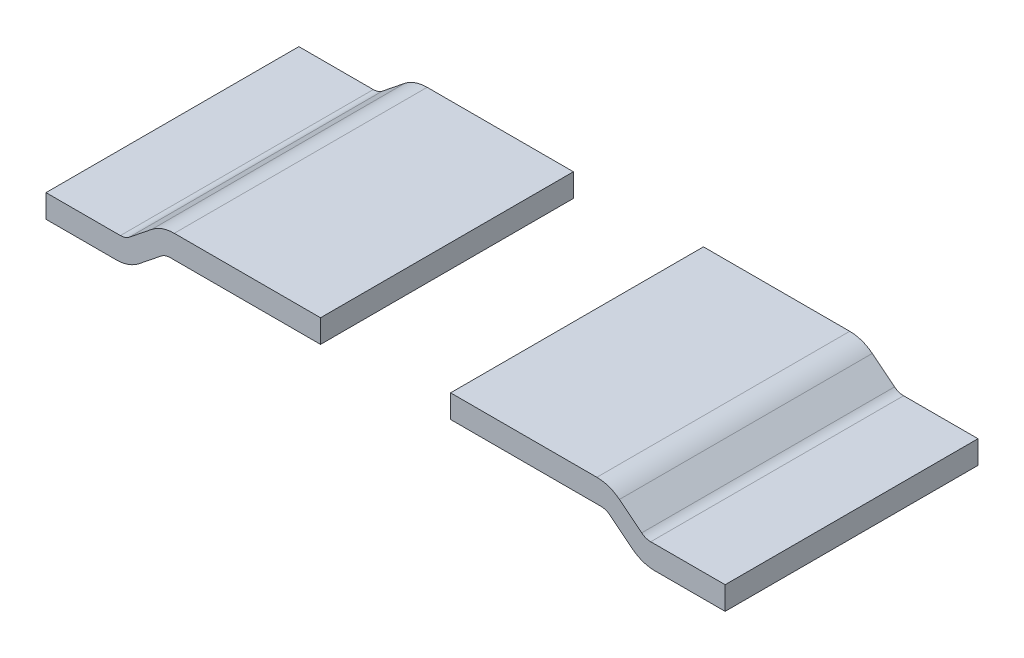
ISO-10303-21;
HEADER;
FILE_DESCRIPTION(('STEP AP214'),'2;1');
FILE_NAME('part.step','',(''),(''),'','','');
FILE_SCHEMA(('AUTOMOTIVE_DESIGN { 1 0 10303 214 1 1 1 1 }'));
ENDSEC;
DATA;
#1=APPLICATION_CONTEXT('core data for automotive mechanical design processes');
#2=APPLICATION_PROTOCOL_DEFINITION('international standard','automotive_design',2000,#1);
#3=PRODUCT_CONTEXT('',#1,'mechanical');
#4=PRODUCT('Part','Part','',(#3));
#5=PRODUCT_RELATED_PRODUCT_CATEGORY('part','',(#4));
#6=PRODUCT_DEFINITION_FORMATION('','',#4);
#7=PRODUCT_DEFINITION_CONTEXT('part definition',#1,'design');
#8=PRODUCT_DEFINITION('design','',#6,#7);
#9=PRODUCT_DEFINITION_SHAPE('','',#8);
#10=(LENGTH_UNIT() NAMED_UNIT(*) SI_UNIT(.MILLI.,.METRE.));
#11=(NAMED_UNIT(*) PLANE_ANGLE_UNIT() SI_UNIT($,.RADIAN.));
#12=(NAMED_UNIT(*) SI_UNIT($,.STERADIAN.) SOLID_ANGLE_UNIT());
#13=UNCERTAINTY_MEASURE_WITH_UNIT(LENGTH_MEASURE(1.E-05),#10,'distance_accuracy_value','');
#14=(GEOMETRIC_REPRESENTATION_CONTEXT(3) GLOBAL_UNCERTAINTY_ASSIGNED_CONTEXT((#13)) GLOBAL_UNIT_ASSIGNED_CONTEXT((#10,
#11,#12)) REPRESENTATION_CONTEXT('',''));
#15=CARTESIAN_POINT('',(0.,0.,0.));
#16=DIRECTION('',(0.,0.,1.));
#17=DIRECTION('',(1.,0.,0.));
#18=AXIS2_PLACEMENT_3D('',#15,#16,#17);
#19=CARTESIAN_POINT('',(0.486414083470597,0.25,0.));
#20=DIRECTION('',(0.,0.,1.));
#21=DIRECTION('',(1.,0.,0.));
#22=AXIS2_PLACEMENT_3D('',#19,#20,#21);
#23=PLANE('',#22);
#24=DIRECTION('',(0.,-1.,0.));
#25=VECTOR('',#24,1.);
#26=CARTESIAN_POINT('',(0.,0.16,0.));
#27=LINE('',#26,#25);
#28=CARTESIAN_POINT('',(0.,0.16,0.));
#29=VERTEX_POINT('',#28);
#30=CARTESIAN_POINT('',(0.,0.,0.));
#31=VERTEX_POINT('',#30);
#32=EDGE_CURVE('P0_E141',#29,#31,#27,.T.);
#33=ORIENTED_EDGE('',*,*,#32,.F.);
#34=DIRECTION('',(-1.,0.,0.));
#35=VECTOR('',#34,1.);
#36=CARTESIAN_POINT('',(0.514921894064179,0.16,0.));
#37=LINE('',#36,#35);
#38=CARTESIAN_POINT('',(0.514921894064179,0.16,0.));
#39=VERTEX_POINT('',#38);
#40=EDGE_CURVE('P0_E25',#39,#29,#37,.T.);
#41=ORIENTED_EDGE('',*,*,#40,.F.);
#42=CARTESIAN_POINT('',(0.514921894064179,0.26,0.));
#43=DIRECTION('',(0.,0.,-1.));
#44=DIRECTION('',(-1.,0.,0.));
#45=AXIS2_PLACEMENT_3D('',#42,#43,#44);
#46=CIRCLE('',#45,0.1);
#47=CARTESIAN_POINT('',(0.577391398819622,0.181913119055697,0.));
#48=VERTEX_POINT('',#47);
#49=EDGE_CURVE('P0_E247',#48,#39,#46,.T.);
#50=ORIENTED_EDGE('',*,*,#49,.F.);
#51=DIRECTION('',(-0.78086880944303,-0.624695047554425,0.));
#52=VECTOR('',#51,1.);
#53=CARTESIAN_POINT('',(0.731521502950947,0.305217202360758,0.));
#54=LINE('',#53,#52);
#55=CARTESIAN_POINT('',(0.731521502950947,0.305217202360758,0.));
#56=VERTEX_POINT('',#55);
#57=EDGE_CURVE('P0_E259',#56,#48,#54,.T.);
#58=ORIENTED_EDGE('',*,*,#57,.F.);
#59=CARTESIAN_POINT('',(0.887695264839554,0.11,0.));
#60=DIRECTION('',(0.,0.,1.));
#61=DIRECTION('',(1.,0.,0.));
#62=AXIS2_PLACEMENT_3D('',#59,#60,#61);
#63=CIRCLE('',#62,0.25);
#64=CARTESIAN_POINT('',(0.887695264839554,0.36,0.));
#65=VERTEX_POINT('',#64);
#66=EDGE_CURVE('P0_E208',#65,#56,#63,.T.);
#67=ORIENTED_EDGE('',*,*,#66,.F.);
#68=DIRECTION('',(-1.,0.,0.));
#69=VECTOR('',#68,1.);
#70=CARTESIAN_POINT('',(1.9,0.36,0.));
#71=LINE('',#70,#69);
#72=CARTESIAN_POINT('',(1.9,0.36,0.));
#73=VERTEX_POINT('',#72);
#74=EDGE_CURVE('P0_E238',#73,#65,#71,.T.);
#75=ORIENTED_EDGE('',*,*,#74,.F.);
#76=DIRECTION('',(0.,1.,0.));
#77=VECTOR('',#76,1.);
#78=CARTESIAN_POINT('',(1.9,0.2,0.));
#79=LINE('',#78,#77);
#80=CARTESIAN_POINT('',(1.9,0.2,0.));
#81=VERTEX_POINT('',#80);
#82=EDGE_CURVE('P0_E167',#81,#73,#79,.T.);
#83=ORIENTED_EDGE('',*,*,#82,.F.);
#84=DIRECTION('',(1.,0.,0.));
#85=VECTOR('',#84,1.);
#86=CARTESIAN_POINT('',(0.859187454245971,0.2,0.));
#87=LINE('',#86,#85);
#88=CARTESIAN_POINT('',(0.859187454245971,0.2,0.));
#89=VERTEX_POINT('',#88);
#90=EDGE_CURVE('P0_E181',#89,#81,#87,.T.);
#91=ORIENTED_EDGE('',*,*,#90,.F.);
#92=CARTESIAN_POINT('',(0.859187454245971,0.1,0.));
#93=DIRECTION('',(0.,0.,-1.));
#94=DIRECTION('',(-1.,0.,0.));
#95=AXIS2_PLACEMENT_3D('',#92,#93,#94);
#96=CIRCLE('',#95,0.1);
#97=CARTESIAN_POINT('',(0.796717949490529,0.178086880944303,0.));
#98=VERTEX_POINT('',#97);
#99=EDGE_CURVE('P0_E188',#98,#89,#96,.T.);
#100=ORIENTED_EDGE('',*,*,#99,.F.);
#101=DIRECTION('',(0.78086880944303,0.624695047554425,0.));
#102=VECTOR('',#101,1.);
#103=CARTESIAN_POINT('',(0.642587845359204,0.0547827976392426,0.));
#104=LINE('',#103,#102);
#105=CARTESIAN_POINT('',(0.642587845359204,0.0547827976392425,0.));
#106=VERTEX_POINT('',#105);
#107=EDGE_CURVE('P0_E196',#106,#98,#104,.T.);
#108=ORIENTED_EDGE('',*,*,#107,.F.);
#109=CARTESIAN_POINT('',(0.486414083470597,0.25,0.));
#110=DIRECTION('',(0.,0.,1.));
#111=DIRECTION('',(1.,0.,0.));
#112=AXIS2_PLACEMENT_3D('',#109,#110,#111);
#113=CIRCLE('',#112,0.25);
#114=CARTESIAN_POINT('',(0.486414083470597,0.,0.));
#115=VERTEX_POINT('',#114);
#116=EDGE_CURVE('P0_E159',#115,#106,#113,.T.);
#117=ORIENTED_EDGE('',*,*,#116,.F.);
#118=DIRECTION('',(1.,0.,0.));
#119=VECTOR('',#118,1.);
#120=CARTESIAN_POINT('',(0.,0.,0.));
#121=LINE('',#120,#119);
#122=EDGE_CURVE('P0_E150',#31,#115,#121,.T.);
#123=ORIENTED_EDGE('',*,*,#122,.F.);
#124=EDGE_LOOP('',(#33,#41,#50,#58,#67,#75,#83,#91,#100,#108,#117,#123));
#125=FACE_BOUND('',#124,.T.);
#126=ADVANCED_FACE('P0_F16',(#125),#23,.F.);
#127=CARTESIAN_POINT('',(0.486414083470597,0.25,1.75));
#128=DIRECTION('',(0.,0.,1.));
#129=DIRECTION('',(1.,0.,0.));
#130=AXIS2_PLACEMENT_3D('',#127,#128,#129);
#131=PLANE('',#130);
#132=DIRECTION('',(0.,-1.,0.));
#133=VECTOR('',#132,1.);
#134=CARTESIAN_POINT('',(0.,0.16,1.75));
#135=LINE('',#134,#133);
#136=CARTESIAN_POINT('',(0.,0.16,1.75));
#137=VERTEX_POINT('',#136);
#138=CARTESIAN_POINT('',(0.,0.,1.75));
#139=VERTEX_POINT('',#138);
#140=EDGE_CURVE('P0_E144',#137,#139,#135,.T.);
#141=ORIENTED_EDGE('',*,*,#140,.T.);
#142=DIRECTION('',(1.,0.,0.));
#143=VECTOR('',#142,1.);
#144=CARTESIAN_POINT('',(0.,0.,1.75));
#145=LINE('',#144,#143);
#146=CARTESIAN_POINT('',(0.486414083470597,0.,1.75));
#147=VERTEX_POINT('',#146);
#148=EDGE_CURVE('P0_E163',#139,#147,#145,.T.);
#149=ORIENTED_EDGE('',*,*,#148,.T.);
#150=CARTESIAN_POINT('',(0.486414083470597,0.25,1.75));
#151=DIRECTION('',(0.,0.,1.));
#152=DIRECTION('',(1.,0.,0.));
#153=AXIS2_PLACEMENT_3D('',#150,#151,#152);
#154=CIRCLE('',#153,0.25);
#155=CARTESIAN_POINT('',(0.642587845359204,0.0547827976392425,1.75));
#156=VERTEX_POINT('',#155);
#157=EDGE_CURVE('P0_E197',#147,#156,#154,.T.);
#158=ORIENTED_EDGE('',*,*,#157,.T.);
#159=DIRECTION('',(0.78086880944303,0.624695047554425,0.));
#160=VECTOR('',#159,1.);
#161=CARTESIAN_POINT('',(0.642587845359204,0.0547827976392426,1.75));
#162=LINE('',#161,#160);
#163=CARTESIAN_POINT('',(0.796717949490529,0.178086880944303,1.75));
#164=VERTEX_POINT('',#163);
#165=EDGE_CURVE('P0_E193',#156,#164,#162,.T.);
#166=ORIENTED_EDGE('',*,*,#165,.T.);
#167=CARTESIAN_POINT('',(0.859187454245971,0.1,1.75));
#168=DIRECTION('',(0.,0.,-1.));
#169=DIRECTION('',(-1.,0.,0.));
#170=AXIS2_PLACEMENT_3D('',#167,#168,#169);
#171=CIRCLE('',#170,0.1);
#172=CARTESIAN_POINT('',(0.859187454245971,0.2,1.75));
#173=VERTEX_POINT('',#172);
#174=EDGE_CURVE('P0_E179',#164,#173,#171,.T.);
#175=ORIENTED_EDGE('',*,*,#174,.T.);
#176=DIRECTION('',(1.,0.,0.));
#177=VECTOR('',#176,1.);
#178=CARTESIAN_POINT('',(0.859187454245971,0.2,1.75));
#179=LINE('',#178,#177);
#180=CARTESIAN_POINT('',(1.9,0.2,1.75));
#181=VERTEX_POINT('',#180);
#182=EDGE_CURVE('P0_E171',#173,#181,#179,.T.);
#183=ORIENTED_EDGE('',*,*,#182,.T.);
#184=DIRECTION('',(0.,1.,0.));
#185=VECTOR('',#184,1.);
#186=CARTESIAN_POINT('',(1.9,0.2,1.75));
#187=LINE('',#186,#185);
#188=CARTESIAN_POINT('',(1.9,0.36,1.75));
#189=VERTEX_POINT('',#188);
#190=EDGE_CURVE('P0_E231',#181,#189,#187,.T.);
#191=ORIENTED_EDGE('',*,*,#190,.T.);
#192=DIRECTION('',(-1.,0.,0.));
#193=VECTOR('',#192,1.);
#194=CARTESIAN_POINT('',(1.9,0.36,1.75));
#195=LINE('',#194,#193);
#196=CARTESIAN_POINT('',(0.887695264839554,0.36,1.75));
#197=VERTEX_POINT('',#196);
#198=EDGE_CURVE('P0_E246',#189,#197,#195,.T.);
#199=ORIENTED_EDGE('',*,*,#198,.T.);
#200=CARTESIAN_POINT('',(0.887695264839554,0.11,1.75));
#201=DIRECTION('',(0.,0.,1.));
#202=DIRECTION('',(1.,0.,0.));
#203=AXIS2_PLACEMENT_3D('',#200,#201,#202);
#204=CIRCLE('',#203,0.25);
#205=CARTESIAN_POINT('',(0.731521502950947,0.305217202360758,1.75));
#206=VERTEX_POINT('',#205);
#207=EDGE_CURVE('P0_E210',#197,#206,#204,.T.);
#208=ORIENTED_EDGE('',*,*,#207,.T.);
#209=DIRECTION('',(-0.78086880944303,-0.624695047554425,0.));
#210=VECTOR('',#209,1.);
#211=CARTESIAN_POINT('',(0.731521502950947,0.305217202360758,1.75));
#212=LINE('',#211,#210);
#213=CARTESIAN_POINT('',(0.577391398819622,0.181913119055697,1.75));
#214=VERTEX_POINT('',#213);
#215=EDGE_CURVE('P0_E270',#206,#214,#212,.T.);
#216=ORIENTED_EDGE('',*,*,#215,.T.);
#217=CARTESIAN_POINT('',(0.514921894064179,0.26,1.75));
#218=DIRECTION('',(0.,0.,-1.));
#219=DIRECTION('',(-1.,0.,0.));
#220=AXIS2_PLACEMENT_3D('',#217,#218,#219);
#221=CIRCLE('',#220,0.1);
#222=CARTESIAN_POINT('',(0.514921894064179,0.16,1.75));
#223=VERTEX_POINT('',#222);
#224=EDGE_CURVE('P0_E138',#214,#223,#221,.T.);
#225=ORIENTED_EDGE('',*,*,#224,.T.);
#226=DIRECTION('',(-1.,0.,0.));
#227=VECTOR('',#226,1.);
#228=CARTESIAN_POINT('',(0.514921894064179,0.16,1.75));
#229=LINE('',#228,#227);
#230=EDGE_CURVE('P0_E11',#223,#137,#229,.T.);
#231=ORIENTED_EDGE('',*,*,#230,.T.);
#232=EDGE_LOOP('',(#141,#149,#158,#166,#175,#183,#191,#199,#208,#216,#225,#231));
#233=FACE_BOUND('',#232,.T.);
#234=ADVANCED_FACE('P0_F280',(#233),#131,.T.);
#235=CARTESIAN_POINT('',(0.514921894064179,0.16,1.75));
#236=DIRECTION('',(0.,-1.,0.));
#237=DIRECTION('',(0.,0.,-1.));
#238=AXIS2_PLACEMENT_3D('',#235,#236,#237);
#239=PLANE('',#238);
#240=ORIENTED_EDGE('',*,*,#40,.T.);
#241=DIRECTION('',(0.,0.,-1.));
#242=VECTOR('',#241,1.);
#243=CARTESIAN_POINT('',(0.,0.16,1.75));
#244=LINE('',#243,#242);
#245=EDGE_CURVE('P0_E135',#137,#29,#244,.T.);
#246=ORIENTED_EDGE('',*,*,#245,.F.);
#247=ORIENTED_EDGE('',*,*,#230,.F.);
#248=DIRECTION('',(0.,0.,-1.));
#249=VECTOR('',#248,1.);
#250=CARTESIAN_POINT('',(0.514921894064179,0.16,1.75));
#251=LINE('',#250,#249);
#252=EDGE_CURVE('P0_E134',#223,#39,#251,.T.);
#253=ORIENTED_EDGE('',*,*,#252,.T.);
#254=EDGE_LOOP('',(#240,#246,#247,#253));
#255=FACE_BOUND('',#254,.T.);
#256=ADVANCED_FACE('P0_F131',(#255),#239,.F.);
#257=CARTESIAN_POINT('',(0.514921894064179,0.26,1.75));
#258=DIRECTION('',(0.,0.,-1.));
#259=DIRECTION('',(-1.,0.,0.));
#260=AXIS2_PLACEMENT_3D('',#257,#258,#259);
#261=CYLINDRICAL_SURFACE('',#260,0.1);
#262=ORIENTED_EDGE('',*,*,#49,.T.);
#263=ORIENTED_EDGE('',*,*,#252,.F.);
#264=ORIENTED_EDGE('',*,*,#224,.F.);
#265=DIRECTION('',(0.,0.,-1.));
#266=VECTOR('',#265,1.);
#267=CARTESIAN_POINT('',(0.577391398819622,0.181913119055697,1.75));
#268=LINE('',#267,#266);
#269=EDGE_CURVE('P0_E263',#214,#48,#268,.T.);
#270=ORIENTED_EDGE('',*,*,#269,.T.);
#271=EDGE_LOOP('',(#262,#263,#264,#270));
#272=FACE_BOUND('',#271,.T.);
#273=ADVANCED_FACE('P0_F18',(#272),#261,.F.);
#274=CARTESIAN_POINT('',(0.731521502950947,0.305217202360758,1.75));
#275=DIRECTION('',(0.624695047554425,-0.78086880944303,0.));
#276=DIRECTION('',(0.,0.,-1.));
#277=AXIS2_PLACEMENT_3D('',#274,#275,#276);
#278=PLANE('',#277);
#279=ORIENTED_EDGE('',*,*,#57,.T.);
#280=ORIENTED_EDGE('',*,*,#269,.F.);
#281=ORIENTED_EDGE('',*,*,#215,.F.);
#282=DIRECTION('',(0.,0.,-1.));
#283=VECTOR('',#282,1.);
#284=CARTESIAN_POINT('',(0.731521502950947,0.305217202360758,1.75));
#285=LINE('',#284,#283);
#286=EDGE_CURVE('P0_E201',#206,#56,#285,.T.);
#287=ORIENTED_EDGE('',*,*,#286,.T.);
#288=EDGE_LOOP('',(#279,#280,#281,#287));
#289=FACE_BOUND('',#288,.T.);
#290=ADVANCED_FACE('P0_F282',(#289),#278,.F.);
#291=CARTESIAN_POINT('',(0.887695264839554,0.11,1.75));
#292=DIRECTION('',(0.,0.,-1.));
#293=DIRECTION('',(-1.,0.,0.));
#294=AXIS2_PLACEMENT_3D('',#291,#292,#293);
#295=CYLINDRICAL_SURFACE('',#294,0.25);
#296=ORIENTED_EDGE('',*,*,#66,.T.);
#297=ORIENTED_EDGE('',*,*,#286,.F.);
#298=ORIENTED_EDGE('',*,*,#207,.F.);
#299=DIRECTION('',(0.,0.,-1.));
#300=VECTOR('',#299,1.);
#301=CARTESIAN_POINT('',(0.887695264839554,0.36,1.75));
#302=LINE('',#301,#300);
#303=EDGE_CURVE('P0_E245',#197,#65,#302,.T.);
#304=ORIENTED_EDGE('',*,*,#303,.T.);
#305=EDGE_LOOP('',(#296,#297,#298,#304));
#306=FACE_BOUND('',#305,.T.);
#307=ADVANCED_FACE('P0_F283',(#306),#295,.T.);
#308=CARTESIAN_POINT('',(1.9,0.36,1.75));
#309=DIRECTION('',(0.,-1.,0.));
#310=DIRECTION('',(0.,0.,-1.));
#311=AXIS2_PLACEMENT_3D('',#308,#309,#310);
#312=PLANE('',#311);
#313=ORIENTED_EDGE('',*,*,#74,.T.);
#314=ORIENTED_EDGE('',*,*,#303,.F.);
#315=ORIENTED_EDGE('',*,*,#198,.F.);
#316=DIRECTION('',(0.,0.,-1.));
#317=VECTOR('',#316,1.);
#318=CARTESIAN_POINT('',(1.9,0.36,1.75));
#319=LINE('',#318,#317);
#320=EDGE_CURVE('P0_E168',#189,#73,#319,.T.);
#321=ORIENTED_EDGE('',*,*,#320,.T.);
#322=EDGE_LOOP('',(#313,#314,#315,#321));
#323=FACE_BOUND('',#322,.T.);
#324=ADVANCED_FACE('P0_F290',(#323),#312,.F.);
#325=CARTESIAN_POINT('',(1.9,0.2,1.75));
#326=DIRECTION('',(-1.,0.,0.));
#327=DIRECTION('',(0.,0.,1.));
#328=AXIS2_PLACEMENT_3D('',#325,#326,#327);
#329=PLANE('',#328);
#330=ORIENTED_EDGE('',*,*,#82,.T.);
#331=ORIENTED_EDGE('',*,*,#320,.F.);
#332=ORIENTED_EDGE('',*,*,#190,.F.);
#333=DIRECTION('',(0.,0.,-1.));
#334=VECTOR('',#333,1.);
#335=CARTESIAN_POINT('',(1.9,0.2,1.75));
#336=LINE('',#335,#334);
#337=EDGE_CURVE('P0_E221',#181,#81,#336,.T.);
#338=ORIENTED_EDGE('',*,*,#337,.T.);
#339=EDGE_LOOP('',(#330,#331,#332,#338));
#340=FACE_BOUND('',#339,.T.);
#341=ADVANCED_FACE('P0_F295',(#340),#329,.F.);
#342=CARTESIAN_POINT('',(0.859187454245971,0.2,1.75));
#343=DIRECTION('',(0.,1.,0.));
#344=DIRECTION('',(1.,0.,0.));
#345=AXIS2_PLACEMENT_3D('',#342,#343,#344);
#346=PLANE('',#345);
#347=ORIENTED_EDGE('',*,*,#90,.T.);
#348=ORIENTED_EDGE('',*,*,#337,.F.);
#349=ORIENTED_EDGE('',*,*,#182,.F.);
#350=DIRECTION('',(0.,0.,-1.));
#351=VECTOR('',#350,1.);
#352=CARTESIAN_POINT('',(0.859187454245971,0.2,1.75));
#353=LINE('',#352,#351);
#354=EDGE_CURVE('P0_E183',#173,#89,#353,.T.);
#355=ORIENTED_EDGE('',*,*,#354,.T.);
#356=EDGE_LOOP('',(#347,#348,#349,#355));
#357=FACE_BOUND('',#356,.T.);
#358=ADVANCED_FACE('P0_F293',(#357),#346,.F.);
#359=CARTESIAN_POINT('',(0.859187454245971,0.1,1.75));
#360=DIRECTION('',(0.,0.,-1.));
#361=DIRECTION('',(-1.,0.,0.));
#362=AXIS2_PLACEMENT_3D('',#359,#360,#361);
#363=CYLINDRICAL_SURFACE('',#362,0.1);
#364=ORIENTED_EDGE('',*,*,#99,.T.);
#365=ORIENTED_EDGE('',*,*,#354,.F.);
#366=ORIENTED_EDGE('',*,*,#174,.F.);
#367=DIRECTION('',(0.,0.,-1.));
#368=VECTOR('',#367,1.);
#369=CARTESIAN_POINT('',(0.796717949490529,0.178086880944303,1.75));
#370=LINE('',#369,#368);
#371=EDGE_CURVE('P0_E205',#164,#98,#370,.T.);
#372=ORIENTED_EDGE('',*,*,#371,.T.);
#373=EDGE_LOOP('',(#364,#365,#366,#372));
#374=FACE_BOUND('',#373,.T.);
#375=ADVANCED_FACE('P0_F296',(#374),#363,.F.);
#376=CARTESIAN_POINT('',(0.642587845359204,0.0547827976392426,1.75));
#377=DIRECTION('',(-0.624695047554425,0.78086880944303,0.));
#378=DIRECTION('',(0.,0.,1.));
#379=AXIS2_PLACEMENT_3D('',#376,#377,#378);
#380=PLANE('',#379);
#381=ORIENTED_EDGE('',*,*,#107,.T.);
#382=ORIENTED_EDGE('',*,*,#371,.F.);
#383=ORIENTED_EDGE('',*,*,#165,.F.);
#384=DIRECTION('',(0.,0.,-1.));
#385=VECTOR('',#384,1.);
#386=CARTESIAN_POINT('',(0.642587845359204,0.0547827976392425,1.75));
#387=LINE('',#386,#385);
#388=EDGE_CURVE('P0_E162',#156,#106,#387,.T.);
#389=ORIENTED_EDGE('',*,*,#388,.T.);
#390=EDGE_LOOP('',(#381,#382,#383,#389));
#391=FACE_BOUND('',#390,.T.);
#392=ADVANCED_FACE('P0_F299',(#391),#380,.F.);
#393=CARTESIAN_POINT('',(0.486414083470597,0.25,1.75));
#394=DIRECTION('',(0.,0.,-1.));
#395=DIRECTION('',(-1.,0.,0.));
#396=AXIS2_PLACEMENT_3D('',#393,#394,#395);
#397=CYLINDRICAL_SURFACE('',#396,0.25);
#398=ORIENTED_EDGE('',*,*,#116,.T.);
#399=ORIENTED_EDGE('',*,*,#388,.F.);
#400=ORIENTED_EDGE('',*,*,#157,.F.);
#401=DIRECTION('',(0.,0.,-1.));
#402=VECTOR('',#401,1.);
#403=CARTESIAN_POINT('',(0.486414083470597,0.,1.75));
#404=LINE('',#403,#402);
#405=EDGE_CURVE('P0_E172',#147,#115,#404,.T.);
#406=ORIENTED_EDGE('',*,*,#405,.T.);
#407=EDGE_LOOP('',(#398,#399,#400,#406));
#408=FACE_BOUND('',#407,.T.);
#409=ADVANCED_FACE('P0_F305',(#408),#397,.T.);
#410=CARTESIAN_POINT('',(0.,0.,1.75));
#411=DIRECTION('',(0.,1.,0.));
#412=DIRECTION('',(1.,0.,0.));
#413=AXIS2_PLACEMENT_3D('',#410,#411,#412);
#414=PLANE('',#413);
#415=ORIENTED_EDGE('',*,*,#122,.T.);
#416=ORIENTED_EDGE('',*,*,#405,.F.);
#417=ORIENTED_EDGE('',*,*,#148,.F.);
#418=DIRECTION('',(0.,0.,-1.));
#419=VECTOR('',#418,1.);
#420=CARTESIAN_POINT('',(0.,0.,1.75));
#421=LINE('',#420,#419);
#422=EDGE_CURVE('P0_E155',#139,#31,#421,.T.);
#423=ORIENTED_EDGE('',*,*,#422,.T.);
#424=EDGE_LOOP('',(#415,#416,#417,#423));
#425=FACE_BOUND('',#424,.T.);
#426=ADVANCED_FACE('P0_F304',(#425),#414,.F.);
#427=CARTESIAN_POINT('',(0.,0.16,1.75));
#428=DIRECTION('',(1.,0.,0.));
#429=DIRECTION('',(0.,1.,0.));
#430=AXIS2_PLACEMENT_3D('',#427,#428,#429);
#431=PLANE('',#430);
#432=ORIENTED_EDGE('',*,*,#32,.T.);
#433=ORIENTED_EDGE('',*,*,#422,.F.);
#434=ORIENTED_EDGE('',*,*,#140,.F.);
#435=ORIENTED_EDGE('',*,*,#245,.T.);
#436=EDGE_LOOP('',(#432,#433,#434,#435));
#437=FACE_BOUND('',#436,.T.);
#438=ADVANCED_FACE('P0_F143',(#437),#431,.F.);
#439=CLOSED_SHELL('',(#126,#234,#256,#273,#290,#307,#324,#341,#358,#375,#392,#409,#426,#438));
#440=MANIFOLD_SOLID_BREP('P0_B1',#439);
#441=CARTESIAN_POINT('',(4.2135859165294,0.25,0.));
#442=DIRECTION('',(0.,0.,-1.));
#443=DIRECTION('',(0.,-1.,0.));
#444=AXIS2_PLACEMENT_3D('',#441,#442,#443);
#445=PLANE('',#444);
#446=CARTESIAN_POINT('',(4.2135859165294,0.25,0.));
#447=DIRECTION('',(0.,0.,1.));
#448=DIRECTION('',(-1.,0.,0.));
#449=AXIS2_PLACEMENT_3D('',#446,#447,#448);
#450=CIRCLE('',#449,0.25);
#451=CARTESIAN_POINT('',(4.0574121546408,0.0547827976392434,0.));
#452=VERTEX_POINT('',#451);
#453=CARTESIAN_POINT('',(4.2135859165294,0.,0.));
#454=VERTEX_POINT('',#453);
#455=EDGE_CURVE('P1_E142',#452,#454,#450,.T.);
#456=ORIENTED_EDGE('',*,*,#455,.F.);
#457=DIRECTION('',(0.78086880944303,-0.624695047554425,0.));
#458=VECTOR('',#457,1.);
#459=CARTESIAN_POINT('',(4.0574121546408,0.0547827976392434,0.));
#460=LINE('',#459,#458);
#461=CARTESIAN_POINT('',(3.90328205050947,0.178086880944303,0.));
#462=VERTEX_POINT('',#461);
#463=EDGE_CURVE('P1_E25',#462,#452,#460,.T.);
#464=ORIENTED_EDGE('',*,*,#463,.F.);
#465=CARTESIAN_POINT('',(3.84081254575403,0.1,0.));
#466=DIRECTION('',(0.,0.,-1.));
#467=DIRECTION('',(1.,0.,0.));
#468=AXIS2_PLACEMENT_3D('',#465,#466,#467);
#469=CIRCLE('',#468,0.1);
#470=CARTESIAN_POINT('',(3.84081254575403,0.2,0.));
#471=VERTEX_POINT('',#470);
#472=EDGE_CURVE('P1_E264',#471,#462,#469,.T.);
#473=ORIENTED_EDGE('',*,*,#472,.F.);
#474=DIRECTION('',(1.,0.,0.));
#475=VECTOR('',#474,1.);
#476=CARTESIAN_POINT('',(3.84081254575403,0.2,0.));
#477=LINE('',#476,#475);
#478=CARTESIAN_POINT('',(2.8,0.2,0.));
#479=VERTEX_POINT('',#478);
#480=EDGE_CURVE('P1_E242',#479,#471,#477,.T.);
#481=ORIENTED_EDGE('',*,*,#480,.F.);
#482=DIRECTION('',(0.,-1.,0.));
#483=VECTOR('',#482,1.);
#484=CARTESIAN_POINT('',(2.8,0.2,0.));
#485=LINE('',#484,#483);
#486=CARTESIAN_POINT('',(2.8,0.36,0.));
#487=VERTEX_POINT('',#486);
#488=EDGE_CURVE('P1_E250',#487,#479,#485,.T.);
#489=ORIENTED_EDGE('',*,*,#488,.F.);
#490=DIRECTION('',(-1.,0.,0.));
#491=VECTOR('',#490,1.);
#492=CARTESIAN_POINT('',(2.8,0.36,0.));
#493=LINE('',#492,#491);
#494=CARTESIAN_POINT('',(3.81230473516045,0.36,0.));
#495=VERTEX_POINT('',#494);
#496=EDGE_CURVE('P1_E163',#495,#487,#493,.T.);
#497=ORIENTED_EDGE('',*,*,#496,.F.);
#498=CARTESIAN_POINT('',(3.81230473516045,0.11,0.));
#499=DIRECTION('',(0.,0.,1.));
#500=DIRECTION('',(-1.,0.,0.));
#501=AXIS2_PLACEMENT_3D('',#498,#499,#500);
#502=CIRCLE('',#501,0.25);
#503=CARTESIAN_POINT('',(3.96847849704905,0.305217202360758,0.));
#504=VERTEX_POINT('',#503);
#505=EDGE_CURVE('P1_E227',#504,#495,#502,.T.);
#506=ORIENTED_EDGE('',*,*,#505,.F.);
#507=DIRECTION('',(-0.78086880944303,0.624695047554424,0.));
#508=VECTOR('',#507,1.);
#509=CARTESIAN_POINT('',(3.96847849704905,0.305217202360758,0.));
#510=LINE('',#509,#508);
#511=CARTESIAN_POINT('',(4.12260860118038,0.181913119055697,0.));
#512=VERTEX_POINT('',#511);
#513=EDGE_CURVE('P1_E175',#512,#504,#510,.T.);
#514=ORIENTED_EDGE('',*,*,#513,.F.);
#515=CARTESIAN_POINT('',(4.18507810593582,0.26,0.));
#516=DIRECTION('',(0.,0.,-1.));
#517=DIRECTION('',(1.,0.,0.));
#518=AXIS2_PLACEMENT_3D('',#515,#516,#517);
#519=CIRCLE('',#518,0.1);
#520=CARTESIAN_POINT('',(4.18507810593582,0.16,0.));
#521=VERTEX_POINT('',#520);
#522=EDGE_CURVE('P1_E201',#521,#512,#519,.T.);
#523=ORIENTED_EDGE('',*,*,#522,.F.);
#524=DIRECTION('',(-1.,0.,0.));
#525=VECTOR('',#524,1.);
#526=CARTESIAN_POINT('',(4.18507810593582,0.16,0.));
#527=LINE('',#526,#525);
#528=CARTESIAN_POINT('',(4.7,0.16,0.));
#529=VERTEX_POINT('',#528);
#530=EDGE_CURVE('P1_E159',#529,#521,#527,.T.);
#531=ORIENTED_EDGE('',*,*,#530,.F.);
#532=DIRECTION('',(0.,1.,0.));
#533=VECTOR('',#532,1.);
#534=CARTESIAN_POINT('',(4.7,0.16,0.));
#535=LINE('',#534,#533);
#536=CARTESIAN_POINT('',(4.7,0.,0.));
#537=VERTEX_POINT('',#536);
#538=EDGE_CURVE('P1_E178',#537,#529,#535,.T.);
#539=ORIENTED_EDGE('',*,*,#538,.F.);
#540=DIRECTION('',(1.,0.,0.));
#541=VECTOR('',#540,1.);
#542=CARTESIAN_POINT('',(4.7,0.,0.));
#543=LINE('',#542,#541);
#544=EDGE_CURVE('P1_E148',#454,#537,#543,.T.);
#545=ORIENTED_EDGE('',*,*,#544,.F.);
#546=EDGE_LOOP('',(#456,#464,#473,#481,#489,#497,#506,#514,#523,#531,#539,#545));
#547=FACE_BOUND('',#546,.T.);
#548=ADVANCED_FACE('P1_F16',(#547),#445,.T.);
#549=CARTESIAN_POINT('',(4.2135859165294,0.25,1.75));
#550=DIRECTION('',(0.,0.,-1.));
#551=DIRECTION('',(0.,-1.,0.));
#552=AXIS2_PLACEMENT_3D('',#549,#550,#551);
#553=PLANE('',#552);
#554=CARTESIAN_POINT('',(4.2135859165294,0.25,1.75));
#555=DIRECTION('',(0.,0.,1.));
#556=DIRECTION('',(-1.,0.,0.));
#557=AXIS2_PLACEMENT_3D('',#554,#555,#556);
#558=CIRCLE('',#557,0.25);
#559=CARTESIAN_POINT('',(4.0574121546408,0.0547827976392434,1.75));
#560=VERTEX_POINT('',#559);
#561=CARTESIAN_POINT('',(4.2135859165294,0.,1.75));
#562=VERTEX_POINT('',#561);
#563=EDGE_CURVE('P1_E145',#560,#562,#558,.T.);
#564=ORIENTED_EDGE('',*,*,#563,.T.);
#565=DIRECTION('',(1.,0.,0.));
#566=VECTOR('',#565,1.);
#567=CARTESIAN_POINT('',(4.7,0.,1.75));
#568=LINE('',#567,#566);
#569=CARTESIAN_POINT('',(4.7,0.,1.75));
#570=VERTEX_POINT('',#569);
#571=EDGE_CURVE('P1_E181',#562,#570,#568,.T.);
#572=ORIENTED_EDGE('',*,*,#571,.T.);
#573=DIRECTION('',(0.,1.,0.));
#574=VECTOR('',#573,1.);
#575=CARTESIAN_POINT('',(4.7,0.16,1.75));
#576=LINE('',#575,#574);
#577=CARTESIAN_POINT('',(4.7,0.16,1.75));
#578=VERTEX_POINT('',#577);
#579=EDGE_CURVE('P1_E212',#570,#578,#576,.T.);
#580=ORIENTED_EDGE('',*,*,#579,.T.);
#581=DIRECTION('',(-1.,0.,0.));
#582=VECTOR('',#581,1.);
#583=CARTESIAN_POINT('',(4.18507810593582,0.16,1.75));
#584=LINE('',#583,#582);
#585=CARTESIAN_POINT('',(4.18507810593582,0.16,1.75));
#586=VERTEX_POINT('',#585);
#587=EDGE_CURVE('P1_E191',#578,#586,#584,.T.);
#588=ORIENTED_EDGE('',*,*,#587,.T.);
#589=CARTESIAN_POINT('',(4.18507810593582,0.26,1.75));
#590=DIRECTION('',(0.,0.,-1.));
#591=DIRECTION('',(1.,0.,0.));
#592=AXIS2_PLACEMENT_3D('',#589,#590,#591);
#593=CIRCLE('',#592,0.1);
#594=CARTESIAN_POINT('',(4.12260860118038,0.181913119055697,1.75));
#595=VERTEX_POINT('',#594);
#596=EDGE_CURVE('P1_E195',#586,#595,#593,.T.);
#597=ORIENTED_EDGE('',*,*,#596,.T.);
#598=DIRECTION('',(-0.78086880944303,0.624695047554424,0.));
#599=VECTOR('',#598,1.);
#600=CARTESIAN_POINT('',(3.96847849704905,0.305217202360758,1.75));
#601=LINE('',#600,#599);
#602=CARTESIAN_POINT('',(3.96847849704905,0.305217202360758,1.75));
#603=VERTEX_POINT('',#602);
#604=EDGE_CURVE('P1_E173',#595,#603,#601,.T.);
#605=ORIENTED_EDGE('',*,*,#604,.T.);
#606=CARTESIAN_POINT('',(3.81230473516045,0.11,1.75));
#607=DIRECTION('',(0.,0.,1.));
#608=DIRECTION('',(-1.,0.,0.));
#609=AXIS2_PLACEMENT_3D('',#606,#607,#608);
#610=CIRCLE('',#609,0.25);
#611=CARTESIAN_POINT('',(3.81230473516045,0.36,1.75));
#612=VERTEX_POINT('',#611);
#613=EDGE_CURVE('P1_E169',#603,#612,#610,.T.);
#614=ORIENTED_EDGE('',*,*,#613,.T.);
#615=DIRECTION('',(-1.,0.,0.));
#616=VECTOR('',#615,1.);
#617=CARTESIAN_POINT('',(2.8,0.36,1.75));
#618=LINE('',#617,#616);
#619=CARTESIAN_POINT('',(2.8,0.36,1.75));
#620=VERTEX_POINT('',#619);
#621=EDGE_CURVE('P1_E210',#612,#620,#618,.T.);
#622=ORIENTED_EDGE('',*,*,#621,.T.);
#623=DIRECTION('',(0.,-1.,0.));
#624=VECTOR('',#623,1.);
#625=CARTESIAN_POINT('',(2.8,0.2,1.75));
#626=LINE('',#625,#624);
#627=CARTESIAN_POINT('',(2.8,0.2,1.75));
#628=VERTEX_POINT('',#627);
#629=EDGE_CURVE('P1_E254',#620,#628,#626,.T.);
#630=ORIENTED_EDGE('',*,*,#629,.T.);
#631=DIRECTION('',(1.,0.,0.));
#632=VECTOR('',#631,1.);
#633=CARTESIAN_POINT('',(3.84081254575403,0.2,1.75));
#634=LINE('',#633,#632);
#635=CARTESIAN_POINT('',(3.84081254575403,0.2,1.75));
#636=VERTEX_POINT('',#635);
#637=EDGE_CURVE('P1_E245',#628,#636,#634,.T.);
#638=ORIENTED_EDGE('',*,*,#637,.T.);
#639=CARTESIAN_POINT('',(3.84081254575403,0.1,1.75));
#640=DIRECTION('',(0.,0.,-1.));
#641=DIRECTION('',(1.,0.,0.));
#642=AXIS2_PLACEMENT_3D('',#639,#640,#641);
#643=CIRCLE('',#642,0.1);
#644=CARTESIAN_POINT('',(3.90328205050947,0.178086880944303,1.75));
#645=VERTEX_POINT('',#644);
#646=EDGE_CURVE('P1_E140',#636,#645,#643,.T.);
#647=ORIENTED_EDGE('',*,*,#646,.T.);
#648=DIRECTION('',(0.78086880944303,-0.624695047554425,0.));
#649=VECTOR('',#648,1.);
#650=CARTESIAN_POINT('',(4.0574121546408,0.0547827976392434,1.75));
#651=LINE('',#650,#649);
#652=EDGE_CURVE('P1_E11',#645,#560,#651,.T.);
#653=ORIENTED_EDGE('',*,*,#652,.T.);
#654=EDGE_LOOP('',(#564,#572,#580,#588,#597,#605,#614,#622,#630,#638,#647,#653));
#655=FACE_BOUND('',#654,.T.);
#656=ADVANCED_FACE('P1_F273',(#655),#553,.F.);
#657=CARTESIAN_POINT('',(4.0574121546408,0.0547827976392434,1.75));
#658=DIRECTION('',(0.624695047554425,0.78086880944303,0.));
#659=DIRECTION('',(0.,0.,-1.));
#660=AXIS2_PLACEMENT_3D('',#657,#658,#659);
#661=PLANE('',#660);
#662=ORIENTED_EDGE('',*,*,#463,.T.);
#663=DIRECTION('',(0.,0.,-1.));
#664=VECTOR('',#663,1.);
#665=CARTESIAN_POINT('',(4.0574121546408,0.0547827976392434,1.75));
#666=LINE('',#665,#664);
#667=EDGE_CURVE('P1_E131',#560,#452,#666,.T.);
#668=ORIENTED_EDGE('',*,*,#667,.F.);
#669=ORIENTED_EDGE('',*,*,#652,.F.);
#670=DIRECTION('',(0.,0.,-1.));
#671=VECTOR('',#670,1.);
#672=CARTESIAN_POINT('',(3.90328205050947,0.178086880944303,1.75));
#673=LINE('',#672,#671);
#674=EDGE_CURVE('P1_E133',#645,#462,#673,.T.);
#675=ORIENTED_EDGE('',*,*,#674,.T.);
#676=EDGE_LOOP('',(#662,#668,#669,#675));
#677=FACE_BOUND('',#676,.T.);
#678=ADVANCED_FACE('P1_F18',(#677),#661,.F.);
#679=CARTESIAN_POINT('',(3.84081254575403,0.1,1.75));
#680=DIRECTION('',(0.,0.,-1.));
#681=DIRECTION('',(-1.,0.,0.));
#682=AXIS2_PLACEMENT_3D('',#679,#680,#681);
#683=CYLINDRICAL_SURFACE('',#682,0.1);
#684=ORIENTED_EDGE('',*,*,#472,.T.);
#685=ORIENTED_EDGE('',*,*,#674,.F.);
#686=ORIENTED_EDGE('',*,*,#646,.F.);
#687=DIRECTION('',(0.,0.,-1.));
#688=VECTOR('',#687,1.);
#689=CARTESIAN_POINT('',(3.84081254575403,0.2,1.75));
#690=LINE('',#689,#688);
#691=EDGE_CURVE('P1_E238',#636,#471,#690,.T.);
#692=ORIENTED_EDGE('',*,*,#691,.T.);
#693=EDGE_LOOP('',(#684,#685,#686,#692));
#694=FACE_BOUND('',#693,.T.);
#695=ADVANCED_FACE('P1_F280',(#694),#683,.F.);
#696=CARTESIAN_POINT('',(3.84081254575403,0.2,1.75));
#697=DIRECTION('',(0.,1.,0.));
#698=DIRECTION('',(1.,0.,0.));
#699=AXIS2_PLACEMENT_3D('',#696,#697,#698);
#700=PLANE('',#699);
#701=ORIENTED_EDGE('',*,*,#480,.T.);
#702=ORIENTED_EDGE('',*,*,#691,.F.);
#703=ORIENTED_EDGE('',*,*,#637,.F.);
#704=DIRECTION('',(0.,0.,-1.));
#705=VECTOR('',#704,1.);
#706=CARTESIAN_POINT('',(2.8,0.2,1.75));
#707=LINE('',#706,#705);
#708=EDGE_CURVE('P1_E253',#628,#479,#707,.T.);
#709=ORIENTED_EDGE('',*,*,#708,.T.);
#710=EDGE_LOOP('',(#701,#702,#703,#709));
#711=FACE_BOUND('',#710,.T.);
#712=ADVANCED_FACE('P1_F278',(#711),#700,.F.);
#713=CARTESIAN_POINT('',(2.8,0.2,1.75));
#714=DIRECTION('',(1.,0.,0.));
#715=DIRECTION('',(0.,1.,0.));
#716=AXIS2_PLACEMENT_3D('',#713,#714,#715);
#717=PLANE('',#716);
#718=ORIENTED_EDGE('',*,*,#488,.T.);
#719=ORIENTED_EDGE('',*,*,#708,.F.);
#720=ORIENTED_EDGE('',*,*,#629,.F.);
#721=DIRECTION('',(0.,0.,-1.));
#722=VECTOR('',#721,1.);
#723=CARTESIAN_POINT('',(2.8,0.36,1.75));
#724=LINE('',#723,#722);
#725=EDGE_CURVE('P1_E170',#620,#487,#724,.T.);
#726=ORIENTED_EDGE('',*,*,#725,.T.);
#727=EDGE_LOOP('',(#718,#719,#720,#726));
#728=FACE_BOUND('',#727,.T.);
#729=ADVANCED_FACE('P1_F282',(#728),#717,.F.);
#730=CARTESIAN_POINT('',(2.8,0.36,1.75));
#731=DIRECTION('',(0.,-1.,0.));
#732=DIRECTION('',(-1.,0.,0.));
#733=AXIS2_PLACEMENT_3D('',#730,#731,#732);
#734=PLANE('',#733);
#735=ORIENTED_EDGE('',*,*,#496,.T.);
#736=ORIENTED_EDGE('',*,*,#725,.F.);
#737=ORIENTED_EDGE('',*,*,#621,.F.);
#738=DIRECTION('',(0.,0.,-1.));
#739=VECTOR('',#738,1.);
#740=CARTESIAN_POINT('',(3.81230473516045,0.36,1.75));
#741=LINE('',#740,#739);
#742=EDGE_CURVE('P1_E231',#612,#495,#741,.T.);
#743=ORIENTED_EDGE('',*,*,#742,.T.);
#744=EDGE_LOOP('',(#735,#736,#737,#743));
#745=FACE_BOUND('',#744,.T.);
#746=ADVANCED_FACE('P1_F285',(#745),#734,.F.);
#747=CARTESIAN_POINT('',(3.81230473516045,0.11,1.75));
#748=DIRECTION('',(0.,0.,-1.));
#749=DIRECTION('',(-1.,0.,0.));
#750=AXIS2_PLACEMENT_3D('',#747,#748,#749);
#751=CYLINDRICAL_SURFACE('',#750,0.25);
#752=ORIENTED_EDGE('',*,*,#505,.T.);
#753=ORIENTED_EDGE('',*,*,#742,.F.);
#754=ORIENTED_EDGE('',*,*,#613,.F.);
#755=DIRECTION('',(0.,0.,-1.));
#756=VECTOR('',#755,1.);
#757=CARTESIAN_POINT('',(3.96847849704905,0.305217202360758,1.75));
#758=LINE('',#757,#756);
#759=EDGE_CURVE('P1_E168',#603,#504,#758,.T.);
#760=ORIENTED_EDGE('',*,*,#759,.T.);
#761=EDGE_LOOP('',(#752,#753,#754,#760));
#762=FACE_BOUND('',#761,.T.);
#763=ADVANCED_FACE('P1_F287',(#762),#751,.T.);
#764=CARTESIAN_POINT('',(3.96847849704905,0.305217202360758,1.75));
#765=DIRECTION('',(-0.624695047554424,-0.78086880944303,0.));
#766=DIRECTION('',(-0.78086880944303,0.624695047554424,0.));
#767=AXIS2_PLACEMENT_3D('',#764,#765,#766);
#768=PLANE('',#767);
#769=ORIENTED_EDGE('',*,*,#513,.T.);
#770=ORIENTED_EDGE('',*,*,#759,.F.);
#771=ORIENTED_EDGE('',*,*,#604,.F.);
#772=DIRECTION('',(0.,0.,-1.));
#773=VECTOR('',#772,1.);
#774=CARTESIAN_POINT('',(4.12260860118038,0.181913119055697,1.75));
#775=LINE('',#774,#773);
#776=EDGE_CURVE('P1_E198',#595,#512,#775,.T.);
#777=ORIENTED_EDGE('',*,*,#776,.T.);
#778=EDGE_LOOP('',(#769,#770,#771,#777));
#779=FACE_BOUND('',#778,.T.);
#780=ADVANCED_FACE('P1_F295',(#779),#768,.F.);
#781=CARTESIAN_POINT('',(4.18507810593582,0.26,1.75));
#782=DIRECTION('',(0.,0.,-1.));
#783=DIRECTION('',(-1.,0.,0.));
#784=AXIS2_PLACEMENT_3D('',#781,#782,#783);
#785=CYLINDRICAL_SURFACE('',#784,0.1);
#786=ORIENTED_EDGE('',*,*,#522,.T.);
#787=ORIENTED_EDGE('',*,*,#776,.F.);
#788=ORIENTED_EDGE('',*,*,#596,.F.);
#789=DIRECTION('',(0.,0.,-1.));
#790=VECTOR('',#789,1.);
#791=CARTESIAN_POINT('',(4.18507810593582,0.16,1.75));
#792=LINE('',#791,#790);
#793=EDGE_CURVE('P1_E190',#586,#521,#792,.T.);
#794=ORIENTED_EDGE('',*,*,#793,.T.);
#795=EDGE_LOOP('',(#786,#787,#788,#794));
#796=FACE_BOUND('',#795,.T.);
#797=ADVANCED_FACE('P1_F292',(#796),#785,.F.);
#798=CARTESIAN_POINT('',(4.18507810593582,0.16,1.75));
#799=DIRECTION('',(0.,-1.,0.));
#800=DIRECTION('',(-1.,0.,0.));
#801=AXIS2_PLACEMENT_3D('',#798,#799,#800);
#802=PLANE('',#801);
#803=ORIENTED_EDGE('',*,*,#530,.T.);
#804=ORIENTED_EDGE('',*,*,#793,.F.);
#805=ORIENTED_EDGE('',*,*,#587,.F.);
#806=DIRECTION('',(0.,0.,-1.));
#807=VECTOR('',#806,1.);
#808=CARTESIAN_POINT('',(4.7,0.16,1.75));
#809=LINE('',#808,#807);
#810=EDGE_CURVE('P1_E185',#578,#529,#809,.T.);
#811=ORIENTED_EDGE('',*,*,#810,.T.);
#812=EDGE_LOOP('',(#803,#804,#805,#811));
#813=FACE_BOUND('',#812,.T.);
#814=ADVANCED_FACE('P1_F299',(#813),#802,.F.);
#815=CARTESIAN_POINT('',(4.7,0.16,1.75));
#816=DIRECTION('',(-1.,0.,0.));
#817=DIRECTION('',(0.,0.,1.));
#818=AXIS2_PLACEMENT_3D('',#815,#816,#817);
#819=PLANE('',#818);
#820=ORIENTED_EDGE('',*,*,#538,.T.);
#821=ORIENTED_EDGE('',*,*,#810,.F.);
#822=ORIENTED_EDGE('',*,*,#579,.F.);
#823=DIRECTION('',(0.,0.,-1.));
#824=VECTOR('',#823,1.);
#825=CARTESIAN_POINT('',(4.7,0.,1.75));
#826=LINE('',#825,#824);
#827=EDGE_CURVE('P1_E162',#570,#537,#826,.T.);
#828=ORIENTED_EDGE('',*,*,#827,.T.);
#829=EDGE_LOOP('',(#820,#821,#822,#828));
#830=FACE_BOUND('',#829,.T.);
#831=ADVANCED_FACE('P1_F305',(#830),#819,.F.);
#832=CARTESIAN_POINT('',(4.7,0.,1.75));
#833=DIRECTION('',(0.,1.,0.));
#834=DIRECTION('',(1.,0.,0.));
#835=AXIS2_PLACEMENT_3D('',#832,#833,#834);
#836=PLANE('',#835);
#837=ORIENTED_EDGE('',*,*,#544,.T.);
#838=ORIENTED_EDGE('',*,*,#827,.F.);
#839=ORIENTED_EDGE('',*,*,#571,.F.);
#840=DIRECTION('',(0.,0.,-1.));
#841=VECTOR('',#840,1.);
#842=CARTESIAN_POINT('',(4.2135859165294,0.,1.75));
#843=LINE('',#842,#841);
#844=EDGE_CURVE('P1_E151',#562,#454,#843,.T.);
#845=ORIENTED_EDGE('',*,*,#844,.T.);
#846=EDGE_LOOP('',(#837,#838,#839,#845));
#847=FACE_BOUND('',#846,.T.);
#848=ADVANCED_FACE('P1_F304',(#847),#836,.F.);
#849=CARTESIAN_POINT('',(4.2135859165294,0.25,1.75));
#850=DIRECTION('',(0.,0.,-1.));
#851=DIRECTION('',(-1.,0.,0.));
#852=AXIS2_PLACEMENT_3D('',#849,#850,#851);
#853=CYLINDRICAL_SURFACE('',#852,0.25);
#854=ORIENTED_EDGE('',*,*,#455,.T.);
#855=ORIENTED_EDGE('',*,*,#844,.F.);
#856=ORIENTED_EDGE('',*,*,#563,.F.);
#857=ORIENTED_EDGE('',*,*,#667,.T.);
#858=EDGE_LOOP('',(#854,#855,#856,#857));
#859=FACE_BOUND('',#858,.T.);
#860=ADVANCED_FACE('P1_F139',(#859),#853,.T.);
#861=CLOSED_SHELL('',(#548,#656,#678,#695,#712,#729,#746,#763,#780,#797,#814,#831,#848,#860));
#862=MANIFOLD_SOLID_BREP('P1_B1',#861);
#863=ADVANCED_BREP_SHAPE_REPRESENTATION('',(#18,#440,#862),#14);
#864=SHAPE_DEFINITION_REPRESENTATION(#9,#863);
ENDSEC;
END-ISO-10303-21;
